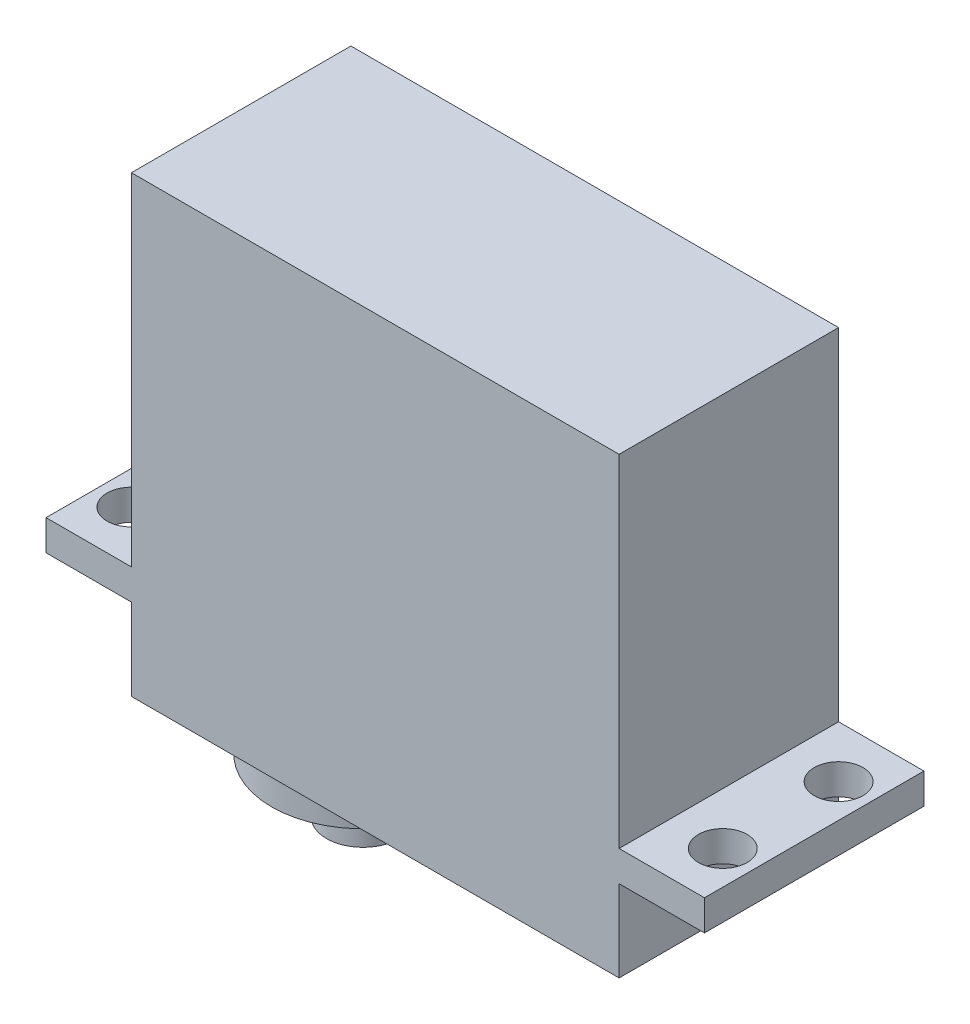
ISO-10303-21;
HEADER;
FILE_DESCRIPTION(('STEP AP214'),'2;1');
FILE_NAME('part.step','',(''),(''),'','','');
FILE_SCHEMA(('AUTOMOTIVE_DESIGN { 1 0 10303 214 1 1 1 1 }'));
ENDSEC;
DATA;
#1=APPLICATION_CONTEXT('core data for automotive mechanical design processes');
#2=APPLICATION_PROTOCOL_DEFINITION('international standard','automotive_design',2000,#1);
#3=PRODUCT_CONTEXT('',#1,'mechanical');
#4=PRODUCT('Part','Part','',(#3));
#5=PRODUCT_RELATED_PRODUCT_CATEGORY('part','',(#4));
#6=PRODUCT_DEFINITION_FORMATION('','',#4);
#7=PRODUCT_DEFINITION_CONTEXT('part definition',#1,'design');
#8=PRODUCT_DEFINITION('design','',#6,#7);
#9=PRODUCT_DEFINITION_SHAPE('','',#8);
#10=(LENGTH_UNIT() NAMED_UNIT(*) SI_UNIT(.MILLI.,.METRE.));
#11=(NAMED_UNIT(*) PLANE_ANGLE_UNIT() SI_UNIT($,.RADIAN.));
#12=(NAMED_UNIT(*) SI_UNIT($,.STERADIAN.) SOLID_ANGLE_UNIT());
#13=UNCERTAINTY_MEASURE_WITH_UNIT(LENGTH_MEASURE(1.E-05),#10,'distance_accuracy_value','');
#14=(GEOMETRIC_REPRESENTATION_CONTEXT(3) GLOBAL_UNCERTAINTY_ASSIGNED_CONTEXT((#13)) GLOBAL_UNIT_ASSIGNED_CONTEXT((#10,
#11,#12)) REPRESENTATION_CONTEXT('',''));
#15=CARTESIAN_POINT('',(0.,0.,0.));
#16=DIRECTION('',(0.,0.,1.));
#17=DIRECTION('',(1.,0.,0.));
#18=AXIS2_PLACEMENT_3D('',#15,#16,#17);
#19=CARTESIAN_POINT('',(0.,0.,0.));
#20=DIRECTION('',(0.,-1.,0.));
#21=DIRECTION('',(0.,0.,-1.));
#22=AXIS2_PLACEMENT_3D('',#19,#20,#21);
#23=PLANE('',#22);
#24=CARTESIAN_POINT('',(24.25,0.,4.75));
#25=DIRECTION('',(0.,-1.,0.));
#26=DIRECTION('',(0.,0.,-1.));
#27=AXIS2_PLACEMENT_3D('',#24,#25,#26);
#28=CIRCLE('',#27,2.);
#29=CARTESIAN_POINT('',(24.25,0.,2.75));
#30=VERTEX_POINT('',#29);
#31=EDGE_CURVE('E304',#30,#30,#28,.T.);
#32=ORIENTED_EDGE('',*,*,#31,.F.);
#33=EDGE_LOOP('',(#32));
#34=FACE_BOUND('',#33,.T.);
#35=CARTESIAN_POINT('',(24.25,0.,-4.75));
#36=DIRECTION('',(0.,-1.,0.));
#37=DIRECTION('',(0.,0.,-1.));
#38=AXIS2_PLACEMENT_3D('',#35,#36,#37);
#39=CIRCLE('',#38,2.);
#40=CARTESIAN_POINT('',(24.25,0.,-6.75));
#41=VERTEX_POINT('',#40);
#42=EDGE_CURVE('E308',#41,#41,#39,.T.);
#43=ORIENTED_EDGE('',*,*,#42,.F.);
#44=EDGE_LOOP('',(#43));
#45=FACE_BOUND('',#44,.T.);
#46=DIRECTION('',(0.,0.,1.));
#47=VECTOR('',#46,1.);
#48=CARTESIAN_POINT('',(20.,0.,-9.));
#49=LINE('',#48,#47);
#50=CARTESIAN_POINT('',(20.,0.,-9.));
#51=VERTEX_POINT('',#50);
#52=CARTESIAN_POINT('',(20.,0.,9.));
#53=VERTEX_POINT('',#52);
#54=EDGE_CURVE('E51',#51,#53,#49,.T.);
#55=ORIENTED_EDGE('',*,*,#54,.F.);
#56=DIRECTION('',(-1.,0.,0.));
#57=VECTOR('',#56,1.);
#58=CARTESIAN_POINT('',(-27.,0.,-9.));
#59=LINE('',#58,#57);
#60=CARTESIAN_POINT('',(27.,0.,-9.));
#61=VERTEX_POINT('',#60);
#62=EDGE_CURVE('E195',#61,#51,#59,.T.);
#63=ORIENTED_EDGE('',*,*,#62,.F.);
#64=DIRECTION('',(0.,0.,-1.));
#65=VECTOR('',#64,1.);
#66=CARTESIAN_POINT('',(27.,0.,9.));
#67=LINE('',#66,#65);
#68=CARTESIAN_POINT('',(27.,0.,9.));
#69=VERTEX_POINT('',#68);
#70=EDGE_CURVE('E178',#69,#61,#67,.T.);
#71=ORIENTED_EDGE('',*,*,#70,.F.);
#72=DIRECTION('',(1.,0.,0.));
#73=VECTOR('',#72,1.);
#74=CARTESIAN_POINT('',(-27.,0.,9.));
#75=LINE('',#74,#73);
#76=EDGE_CURVE('E56',#53,#69,#75,.T.);
#77=ORIENTED_EDGE('',*,*,#76,.F.);
#78=EDGE_LOOP('',(#55,#63,#71,#77));
#79=FACE_BOUND('',#78,.T.);
#80=ADVANCED_FACE('F34',(#34,#45,#79),#23,.T.);
#81=CARTESIAN_POINT('',(0.,2.5,0.));
#82=DIRECTION('',(0.,-1.,0.));
#83=DIRECTION('',(0.,0.,-1.));
#84=AXIS2_PLACEMENT_3D('',#81,#82,#83);
#85=PLANE('',#84);
#86=CARTESIAN_POINT('',(24.25,2.5,4.75));
#87=DIRECTION('',(0.,-1.,0.));
#88=DIRECTION('',(0.,0.,-1.));
#89=AXIS2_PLACEMENT_3D('',#86,#87,#88);
#90=CIRCLE('',#89,2.);
#91=CARTESIAN_POINT('',(24.25,2.5,2.75));
#92=VERTEX_POINT('',#91);
#93=EDGE_CURVE('E38',#92,#92,#90,.T.);
#94=ORIENTED_EDGE('',*,*,#93,.T.);
#95=EDGE_LOOP('',(#94));
#96=FACE_BOUND('',#95,.T.);
#97=CARTESIAN_POINT('',(24.25,2.5,-4.75));
#98=DIRECTION('',(0.,-1.,0.));
#99=DIRECTION('',(0.,0.,-1.));
#100=AXIS2_PLACEMENT_3D('',#97,#98,#99);
#101=CIRCLE('',#100,2.);
#102=CARTESIAN_POINT('',(24.25,2.5,-6.75));
#103=VERTEX_POINT('',#102);
#104=EDGE_CURVE('E212',#103,#103,#101,.T.);
#105=ORIENTED_EDGE('',*,*,#104,.T.);
#106=EDGE_LOOP('',(#105));
#107=FACE_BOUND('',#106,.T.);
#108=DIRECTION('',(0.,0.,-1.));
#109=VECTOR('',#108,1.);
#110=CARTESIAN_POINT('',(20.,2.5,-9.));
#111=LINE('',#110,#109);
#112=CARTESIAN_POINT('',(20.,2.5,9.));
#113=VERTEX_POINT('',#112);
#114=CARTESIAN_POINT('',(20.,2.5,-9.));
#115=VERTEX_POINT('',#114);
#116=EDGE_CURVE('E146',#113,#115,#111,.T.);
#117=ORIENTED_EDGE('',*,*,#116,.F.);
#118=DIRECTION('',(1.,0.,0.));
#119=VECTOR('',#118,1.);
#120=CARTESIAN_POINT('',(-27.,2.5,9.));
#121=LINE('',#120,#119);
#122=CARTESIAN_POINT('',(27.,2.5,9.));
#123=VERTEX_POINT('',#122);
#124=EDGE_CURVE('E188',#113,#123,#121,.T.);
#125=ORIENTED_EDGE('',*,*,#124,.T.);
#126=DIRECTION('',(0.,0.,-1.));
#127=VECTOR('',#126,1.);
#128=CARTESIAN_POINT('',(27.,2.5,9.));
#129=LINE('',#128,#127);
#130=CARTESIAN_POINT('',(27.,2.5,-9.));
#131=VERTEX_POINT('',#130);
#132=EDGE_CURVE('E179',#123,#131,#129,.T.);
#133=ORIENTED_EDGE('',*,*,#132,.T.);
#134=DIRECTION('',(-1.,0.,0.));
#135=VECTOR('',#134,1.);
#136=CARTESIAN_POINT('',(-27.,2.5,-9.));
#137=LINE('',#136,#135);
#138=EDGE_CURVE('E184',#131,#115,#137,.T.);
#139=ORIENTED_EDGE('',*,*,#138,.T.);
#140=EDGE_LOOP('',(#117,#125,#133,#139));
#141=FACE_BOUND('',#140,.T.);
#142=ADVANCED_FACE('F273',(#96,#107,#141),#85,.F.);
#143=CARTESIAN_POINT('',(-24.25,2.5,-4.75));
#144=DIRECTION('',(0.,-1.,0.));
#145=DIRECTION('',(0.,0.,-1.));
#146=AXIS2_PLACEMENT_3D('',#143,#144,#145);
#147=CIRCLE('',#146,2.);
#148=CARTESIAN_POINT('',(-24.25,2.5,-6.75));
#149=VERTEX_POINT('',#148);
#150=EDGE_CURVE('E214',#149,#149,#147,.T.);
#151=ORIENTED_EDGE('',*,*,#150,.T.);
#152=EDGE_LOOP('',(#151));
#153=FACE_BOUND('',#152,.T.);
#154=CARTESIAN_POINT('',(-24.25,2.5,4.75));
#155=DIRECTION('',(0.,-1.,0.));
#156=DIRECTION('',(0.,0.,-1.));
#157=AXIS2_PLACEMENT_3D('',#154,#155,#156);
#158=CIRCLE('',#157,2.);
#159=CARTESIAN_POINT('',(-24.25,2.5,2.75));
#160=VERTEX_POINT('',#159);
#161=EDGE_CURVE('E220',#160,#160,#158,.T.);
#162=ORIENTED_EDGE('',*,*,#161,.T.);
#163=EDGE_LOOP('',(#162));
#164=FACE_BOUND('',#163,.T.);
#165=DIRECTION('',(0.,0.,1.));
#166=VECTOR('',#165,1.);
#167=CARTESIAN_POINT('',(-20.,2.5,-9.));
#168=LINE('',#167,#166);
#169=CARTESIAN_POINT('',(-20.,2.5,-9.));
#170=VERTEX_POINT('',#169);
#171=CARTESIAN_POINT('',(-20.,2.5,9.));
#172=VERTEX_POINT('',#171);
#173=EDGE_CURVE('E149',#170,#172,#168,.T.);
#174=ORIENTED_EDGE('',*,*,#173,.F.);
#175=CARTESIAN_POINT('',(-27.,2.5,-9.));
#176=VERTEX_POINT('',#175);
#177=EDGE_CURVE('E182',#170,#176,#137,.T.);
#178=ORIENTED_EDGE('',*,*,#177,.T.);
#179=DIRECTION('',(0.,0.,1.));
#180=VECTOR('',#179,1.);
#181=CARTESIAN_POINT('',(-27.,2.5,9.));
#182=LINE('',#181,#180);
#183=CARTESIAN_POINT('',(-27.,2.5,9.));
#184=VERTEX_POINT('',#183);
#185=EDGE_CURVE('E186',#176,#184,#182,.T.);
#186=ORIENTED_EDGE('',*,*,#185,.T.);
#187=EDGE_CURVE('E189',#184,#172,#121,.T.);
#188=ORIENTED_EDGE('',*,*,#187,.T.);
#189=EDGE_LOOP('',(#174,#178,#186,#188));
#190=FACE_BOUND('',#189,.T.);
#191=ADVANCED_FACE('F284',(#153,#164,#190),#85,.F.);
#192=CARTESIAN_POINT('',(27.,2.5,9.));
#193=DIRECTION('',(-1.,0.,0.));
#194=DIRECTION('',(0.,0.,1.));
#195=AXIS2_PLACEMENT_3D('',#192,#193,#194);
#196=PLANE('',#195);
#197=ORIENTED_EDGE('',*,*,#70,.T.);
#198=DIRECTION('',(0.,-1.,0.));
#199=VECTOR('',#198,1.);
#200=CARTESIAN_POINT('',(27.,2.5,-9.));
#201=LINE('',#200,#199);
#202=EDGE_CURVE('E208',#131,#61,#201,.T.);
#203=ORIENTED_EDGE('',*,*,#202,.F.);
#204=ORIENTED_EDGE('',*,*,#132,.F.);
#205=DIRECTION('',(0.,-1.,0.));
#206=VECTOR('',#205,1.);
#207=CARTESIAN_POINT('',(27.,2.5,9.));
#208=LINE('',#207,#206);
#209=EDGE_CURVE('E191',#123,#69,#208,.T.);
#210=ORIENTED_EDGE('',*,*,#209,.T.);
#211=EDGE_LOOP('',(#197,#203,#204,#210));
#212=FACE_BOUND('',#211,.T.);
#213=ADVANCED_FACE('F36',(#212),#196,.F.);
#214=CARTESIAN_POINT('',(-27.,2.5,-9.));
#215=DIRECTION('',(0.,0.,1.));
#216=DIRECTION('',(1.,0.,0.));
#217=AXIS2_PLACEMENT_3D('',#214,#215,#216);
#218=PLANE('',#217);
#219=ORIENTED_EDGE('',*,*,#62,.T.);
#220=DIRECTION('',(0.,1.,0.));
#221=VECTOR('',#220,1.);
#222=CARTESIAN_POINT('',(20.,-6.7,-9.));
#223=LINE('',#222,#221);
#224=CARTESIAN_POINT('',(20.,-6.7,-9.));
#225=VERTEX_POINT('',#224);
#226=EDGE_CURVE('E236',#225,#51,#223,.T.);
#227=ORIENTED_EDGE('',*,*,#226,.F.);
#228=DIRECTION('',(1.,0.,0.));
#229=VECTOR('',#228,1.);
#230=CARTESIAN_POINT('',(-20.,-6.7,-9.));
#231=LINE('',#230,#229);
#232=CARTESIAN_POINT('',(-20.,-6.7,-9.));
#233=VERTEX_POINT('',#232);
#234=EDGE_CURVE('E139',#233,#225,#231,.T.);
#235=ORIENTED_EDGE('',*,*,#234,.F.);
#236=DIRECTION('',(0.,1.,0.));
#237=VECTOR('',#236,1.);
#238=CARTESIAN_POINT('',(-20.,-6.7,-9.));
#239=LINE('',#238,#237);
#240=CARTESIAN_POINT('',(-20.,0.,-9.));
#241=VERTEX_POINT('',#240);
#242=EDGE_CURVE('E151',#233,#241,#239,.T.);
#243=ORIENTED_EDGE('',*,*,#242,.T.);
#244=CARTESIAN_POINT('',(-27.,0.,-9.));
#245=VERTEX_POINT('',#244);
#246=EDGE_CURVE('E194',#241,#245,#59,.T.);
#247=ORIENTED_EDGE('',*,*,#246,.T.);
#248=DIRECTION('',(0.,-1.,0.));
#249=VECTOR('',#248,1.);
#250=CARTESIAN_POINT('',(-27.,2.5,-9.));
#251=LINE('',#250,#249);
#252=EDGE_CURVE('E205',#176,#245,#251,.T.);
#253=ORIENTED_EDGE('',*,*,#252,.F.);
#254=ORIENTED_EDGE('',*,*,#177,.F.);
#255=DIRECTION('',(0.,-1.,0.));
#256=VECTOR('',#255,1.);
#257=CARTESIAN_POINT('',(-20.,30.5,-9.));
#258=LINE('',#257,#256);
#259=CARTESIAN_POINT('',(-20.,30.5,-9.));
#260=VERTEX_POINT('',#259);
#261=EDGE_CURVE('E172',#260,#170,#258,.T.);
#262=ORIENTED_EDGE('',*,*,#261,.F.);
#263=DIRECTION('',(-1.,0.,0.));
#264=VECTOR('',#263,1.);
#265=CARTESIAN_POINT('',(-20.,30.5,-9.));
#266=LINE('',#265,#264);
#267=CARTESIAN_POINT('',(20.,30.5,-9.));
#268=VERTEX_POINT('',#267);
#269=EDGE_CURVE('E158',#268,#260,#266,.T.);
#270=ORIENTED_EDGE('',*,*,#269,.F.);
#271=DIRECTION('',(0.,-1.,0.));
#272=VECTOR('',#271,1.);
#273=CARTESIAN_POINT('',(20.,30.5,-9.));
#274=LINE('',#273,#272);
#275=EDGE_CURVE('E175',#268,#115,#274,.T.);
#276=ORIENTED_EDGE('',*,*,#275,.T.);
#277=ORIENTED_EDGE('',*,*,#138,.F.);
#278=ORIENTED_EDGE('',*,*,#202,.T.);
#279=EDGE_LOOP('',(#219,#227,#235,#243,#247,#253,#254,#262,#270,#276,#277,#278));
#280=FACE_BOUND('',#279,.T.);
#281=ADVANCED_FACE('F243',(#280),#218,.F.);
#282=CARTESIAN_POINT('',(-27.,2.5,9.));
#283=DIRECTION('',(1.,0.,0.));
#284=DIRECTION('',(0.,0.,-1.));
#285=AXIS2_PLACEMENT_3D('',#282,#283,#284);
#286=PLANE('',#285);
#287=DIRECTION('',(0.,0.,1.));
#288=VECTOR('',#287,1.);
#289=CARTESIAN_POINT('',(-27.,0.,9.));
#290=LINE('',#289,#288);
#291=CARTESIAN_POINT('',(-27.,0.,9.));
#292=VERTEX_POINT('',#291);
#293=EDGE_CURVE('E197',#245,#292,#290,.T.);
#294=ORIENTED_EDGE('',*,*,#293,.T.);
#295=DIRECTION('',(0.,-1.,0.));
#296=VECTOR('',#295,1.);
#297=CARTESIAN_POINT('',(-27.,2.5,9.));
#298=LINE('',#297,#296);
#299=EDGE_CURVE('E202',#184,#292,#298,.T.);
#300=ORIENTED_EDGE('',*,*,#299,.F.);
#301=ORIENTED_EDGE('',*,*,#185,.F.);
#302=ORIENTED_EDGE('',*,*,#252,.T.);
#303=EDGE_LOOP('',(#294,#300,#301,#302));
#304=FACE_BOUND('',#303,.T.);
#305=ADVANCED_FACE('F255',(#304),#286,.F.);
#306=CARTESIAN_POINT('',(-27.,2.5,9.));
#307=DIRECTION('',(0.,0.,-1.));
#308=DIRECTION('',(-1.,0.,0.));
#309=AXIS2_PLACEMENT_3D('',#306,#307,#308);
#310=PLANE('',#309);
#311=CARTESIAN_POINT('',(-20.,0.,9.));
#312=VERTEX_POINT('',#311);
#313=EDGE_CURVE('E183',#292,#312,#75,.T.);
#314=ORIENTED_EDGE('',*,*,#313,.T.);
#315=DIRECTION('',(0.,1.,0.));
#316=VECTOR('',#315,1.);
#317=CARTESIAN_POINT('',(-20.,-6.7,9.));
#318=LINE('',#317,#316);
#319=CARTESIAN_POINT('',(-20.,-6.7,9.));
#320=VERTEX_POINT('',#319);
#321=EDGE_CURVE('E130',#320,#312,#318,.T.);
#322=ORIENTED_EDGE('',*,*,#321,.F.);
#323=DIRECTION('',(-1.,0.,0.));
#324=VECTOR('',#323,1.);
#325=CARTESIAN_POINT('',(-20.,-6.7,9.));
#326=LINE('',#325,#324);
#327=CARTESIAN_POINT('',(20.,-6.7,9.));
#328=VERTEX_POINT('',#327);
#329=EDGE_CURVE('E123',#328,#320,#326,.T.);
#330=ORIENTED_EDGE('',*,*,#329,.F.);
#331=DIRECTION('',(0.,1.,0.));
#332=VECTOR('',#331,1.);
#333=CARTESIAN_POINT('',(20.,-6.7,9.));
#334=LINE('',#333,#332);
#335=EDGE_CURVE('E128',#328,#53,#334,.T.);
#336=ORIENTED_EDGE('',*,*,#335,.T.);
#337=ORIENTED_EDGE('',*,*,#76,.T.);
#338=ORIENTED_EDGE('',*,*,#209,.F.);
#339=ORIENTED_EDGE('',*,*,#124,.F.);
#340=DIRECTION('',(0.,-1.,0.));
#341=VECTOR('',#340,1.);
#342=CARTESIAN_POINT('',(20.,30.5,9.));
#343=LINE('',#342,#341);
#344=CARTESIAN_POINT('',(20.,30.5,9.));
#345=VERTEX_POINT('',#344);
#346=EDGE_CURVE('E163',#345,#113,#343,.T.);
#347=ORIENTED_EDGE('',*,*,#346,.F.);
#348=DIRECTION('',(1.,0.,0.));
#349=VECTOR('',#348,1.);
#350=CARTESIAN_POINT('',(-20.,30.5,9.));
#351=LINE('',#350,#349);
#352=CARTESIAN_POINT('',(-20.,30.5,9.));
#353=VERTEX_POINT('',#352);
#354=EDGE_CURVE('E162',#353,#345,#351,.T.);
#355=ORIENTED_EDGE('',*,*,#354,.F.);
#356=DIRECTION('',(0.,-1.,0.));
#357=VECTOR('',#356,1.);
#358=CARTESIAN_POINT('',(-20.,30.5,9.));
#359=LINE('',#358,#357);
#360=EDGE_CURVE('E169',#353,#172,#359,.T.);
#361=ORIENTED_EDGE('',*,*,#360,.T.);
#362=ORIENTED_EDGE('',*,*,#187,.F.);
#363=ORIENTED_EDGE('',*,*,#299,.T.);
#364=EDGE_LOOP('',(#314,#322,#330,#336,#337,#338,#339,#347,#355,#361,#362,#363));
#365=FACE_BOUND('',#364,.T.);
#366=ADVANCED_FACE('F126',(#365),#310,.F.);
#367=CARTESIAN_POINT('',(-24.25,0.,-4.75));
#368=DIRECTION('',(0.,-1.,0.));
#369=DIRECTION('',(0.,0.,-1.));
#370=AXIS2_PLACEMENT_3D('',#367,#368,#369);
#371=CIRCLE('',#370,2.);
#372=CARTESIAN_POINT('',(-24.25,0.,-6.75));
#373=VERTEX_POINT('',#372);
#374=EDGE_CURVE('E300',#373,#373,#371,.T.);
#375=ORIENTED_EDGE('',*,*,#374,.F.);
#376=EDGE_LOOP('',(#375));
#377=FACE_BOUND('',#376,.T.);
#378=CARTESIAN_POINT('',(-24.25,0.,4.75));
#379=DIRECTION('',(0.,-1.,0.));
#380=DIRECTION('',(0.,0.,-1.));
#381=AXIS2_PLACEMENT_3D('',#378,#379,#380);
#382=CIRCLE('',#381,2.);
#383=CARTESIAN_POINT('',(-24.25,0.,2.75));
#384=VERTEX_POINT('',#383);
#385=EDGE_CURVE('E225',#384,#384,#382,.T.);
#386=ORIENTED_EDGE('',*,*,#385,.F.);
#387=EDGE_LOOP('',(#386));
#388=FACE_BOUND('',#387,.T.);
#389=DIRECTION('',(0.,0.,-1.));
#390=VECTOR('',#389,1.);
#391=CARTESIAN_POINT('',(-20.,0.,-9.));
#392=LINE('',#391,#390);
#393=EDGE_CURVE('E143',#312,#241,#392,.T.);
#394=ORIENTED_EDGE('',*,*,#393,.F.);
#395=ORIENTED_EDGE('',*,*,#313,.F.);
#396=ORIENTED_EDGE('',*,*,#293,.F.);
#397=ORIENTED_EDGE('',*,*,#246,.F.);
#398=EDGE_LOOP('',(#394,#395,#396,#397));
#399=FACE_BOUND('',#398,.T.);
#400=ADVANCED_FACE('F249',(#377,#388,#399),#23,.T.);
#401=CARTESIAN_POINT('',(20.,30.5,-9.));
#402=DIRECTION('',(-1.,0.,0.));
#403=DIRECTION('',(0.,0.,1.));
#404=AXIS2_PLACEMENT_3D('',#401,#402,#403);
#405=PLANE('',#404);
#406=ORIENTED_EDGE('',*,*,#116,.T.);
#407=ORIENTED_EDGE('',*,*,#275,.F.);
#408=DIRECTION('',(0.,0.,-1.));
#409=VECTOR('',#408,1.);
#410=CARTESIAN_POINT('',(20.,30.5,-9.));
#411=LINE('',#410,#409);
#412=EDGE_CURVE('E155',#345,#268,#411,.T.);
#413=ORIENTED_EDGE('',*,*,#412,.F.);
#414=ORIENTED_EDGE('',*,*,#346,.T.);
#415=EDGE_LOOP('',(#406,#407,#413,#414));
#416=FACE_BOUND('',#415,.T.);
#417=ADVANCED_FACE('F270',(#416),#405,.F.);
#418=CARTESIAN_POINT('',(-20.,30.5,-9.));
#419=DIRECTION('',(1.,0.,0.));
#420=DIRECTION('',(0.,0.,-1.));
#421=AXIS2_PLACEMENT_3D('',#418,#419,#420);
#422=PLANE('',#421);
#423=ORIENTED_EDGE('',*,*,#173,.T.);
#424=ORIENTED_EDGE('',*,*,#360,.F.);
#425=DIRECTION('',(0.,0.,1.));
#426=VECTOR('',#425,1.);
#427=CARTESIAN_POINT('',(-20.,30.5,-9.));
#428=LINE('',#427,#426);
#429=EDGE_CURVE('E160',#260,#353,#428,.T.);
#430=ORIENTED_EDGE('',*,*,#429,.F.);
#431=ORIENTED_EDGE('',*,*,#261,.T.);
#432=EDGE_LOOP('',(#423,#424,#430,#431));
#433=FACE_BOUND('',#432,.T.);
#434=ADVANCED_FACE('F261',(#433),#422,.F.);
#435=CARTESIAN_POINT('',(0.,30.5,0.));
#436=DIRECTION('',(0.,1.,0.));
#437=DIRECTION('',(0.,0.,1.));
#438=AXIS2_PLACEMENT_3D('',#435,#436,#437);
#439=PLANE('',#438);
#440=ORIENTED_EDGE('',*,*,#412,.T.);
#441=ORIENTED_EDGE('',*,*,#269,.T.);
#442=ORIENTED_EDGE('',*,*,#429,.T.);
#443=ORIENTED_EDGE('',*,*,#354,.T.);
#444=EDGE_LOOP('',(#440,#441,#442,#443));
#445=FACE_BOUND('',#444,.T.);
#446=ADVANCED_FACE('F265',(#445),#439,.T.);
#447=CARTESIAN_POINT('',(20.,-6.7,-9.));
#448=DIRECTION('',(-1.,0.,0.));
#449=DIRECTION('',(0.,0.,1.));
#450=AXIS2_PLACEMENT_3D('',#447,#448,#449);
#451=PLANE('',#450);
#452=ORIENTED_EDGE('',*,*,#54,.T.);
#453=ORIENTED_EDGE('',*,*,#335,.F.);
#454=DIRECTION('',(0.,0.,1.));
#455=VECTOR('',#454,1.);
#456=CARTESIAN_POINT('',(20.,-6.7,-9.));
#457=LINE('',#456,#455);
#458=EDGE_CURVE('E134',#225,#328,#457,.T.);
#459=ORIENTED_EDGE('',*,*,#458,.F.);
#460=ORIENTED_EDGE('',*,*,#226,.T.);
#461=EDGE_LOOP('',(#452,#453,#459,#460));
#462=FACE_BOUND('',#461,.T.);
#463=ADVANCED_FACE('F145',(#462),#451,.F.);
#464=CARTESIAN_POINT('',(-20.,-6.7,-9.));
#465=DIRECTION('',(1.,0.,0.));
#466=DIRECTION('',(0.,0.,-1.));
#467=AXIS2_PLACEMENT_3D('',#464,#465,#466);
#468=PLANE('',#467);
#469=ORIENTED_EDGE('',*,*,#393,.T.);
#470=ORIENTED_EDGE('',*,*,#242,.F.);
#471=DIRECTION('',(0.,0.,-1.));
#472=VECTOR('',#471,1.);
#473=CARTESIAN_POINT('',(-20.,-6.7,-9.));
#474=LINE('',#473,#472);
#475=EDGE_CURVE('E133',#320,#233,#474,.T.);
#476=ORIENTED_EDGE('',*,*,#475,.F.);
#477=ORIENTED_EDGE('',*,*,#321,.T.);
#478=EDGE_LOOP('',(#469,#470,#476,#477));
#479=FACE_BOUND('',#478,.T.);
#480=ADVANCED_FACE('F246',(#479),#468,.F.);
#481=CARTESIAN_POINT('',(0.,-6.7,0.));
#482=DIRECTION('',(0.,1.,0.));
#483=DIRECTION('',(0.,0.,1.));
#484=AXIS2_PLACEMENT_3D('',#481,#482,#483);
#485=PLANE('',#484);
#486=CARTESIAN_POINT('',(-10.,-6.7,0.));
#487=DIRECTION('',(0.,1.,0.));
#488=DIRECTION('',(0.,0.,1.));
#489=AXIS2_PLACEMENT_3D('',#486,#487,#488);
#490=CIRCLE('',#489,7.5);
#491=CARTESIAN_POINT('',(-10.,-6.7,7.5));
#492=VERTEX_POINT('',#491);
#493=EDGE_CURVE('E43',#492,#492,#490,.F.);
#494=ORIENTED_EDGE('',*,*,#493,.F.);
#495=EDGE_LOOP('',(#494));
#496=FACE_BOUND('',#495,.T.);
#497=ORIENTED_EDGE('',*,*,#458,.T.);
#498=ORIENTED_EDGE('',*,*,#329,.T.);
#499=ORIENTED_EDGE('',*,*,#475,.T.);
#500=ORIENTED_EDGE('',*,*,#234,.T.);
#501=EDGE_LOOP('',(#497,#498,#499,#500));
#502=FACE_BOUND('',#501,.T.);
#503=ADVANCED_FACE('F137',(#496,#502),#485,.F.);
#504=CARTESIAN_POINT('',(-10.,-10.3,0.));
#505=DIRECTION('',(0.,1.,0.));
#506=DIRECTION('',(0.,0.,1.));
#507=AXIS2_PLACEMENT_3D('',#504,#505,#506);
#508=CYLINDRICAL_SURFACE('',#507,7.5);
#509=CARTESIAN_POINT('',(-10.,-10.3,0.));
#510=DIRECTION('',(0.,-1.,0.));
#511=DIRECTION('',(0.,0.,-1.));
#512=AXIS2_PLACEMENT_3D('',#509,#510,#511);
#513=CIRCLE('',#512,7.5);
#514=CARTESIAN_POINT('',(-10.,-10.3,-7.5));
#515=VERTEX_POINT('',#514);
#516=EDGE_CURVE('E230',#515,#515,#513,.T.);
#517=ORIENTED_EDGE('',*,*,#516,.F.);
#518=EDGE_LOOP('',(#517));
#519=FACE_BOUND('',#518,.T.);
#520=ORIENTED_EDGE('',*,*,#493,.T.);
#521=EDGE_LOOP('',(#520));
#522=FACE_BOUND('',#521,.T.);
#523=ADVANCED_FACE('F342',(#519,#522),#508,.T.);
#524=CARTESIAN_POINT('',(-10.,-10.3,0.));
#525=DIRECTION('',(0.,-1.,0.));
#526=DIRECTION('',(0.,0.,-1.));
#527=AXIS2_PLACEMENT_3D('',#524,#525,#526);
#528=PLANE('',#527);
#529=CARTESIAN_POINT('',(-10.,-10.3,0.));
#530=DIRECTION('',(0.,-1.,0.));
#531=DIRECTION('',(0.,0.,-1.));
#532=AXIS2_PLACEMENT_3D('',#529,#530,#531);
#533=CIRCLE('',#532,3.);
#534=CARTESIAN_POINT('',(-10.,-10.3,-3.));
#535=VERTEX_POINT('',#534);
#536=EDGE_CURVE('E11',#535,#535,#533,.T.);
#537=ORIENTED_EDGE('',*,*,#536,.F.);
#538=EDGE_LOOP('',(#537));
#539=FACE_BOUND('',#538,.T.);
#540=ORIENTED_EDGE('',*,*,#516,.T.);
#541=EDGE_LOOP('',(#540));
#542=FACE_BOUND('',#541,.T.);
#543=ADVANCED_FACE('F338',(#539,#542),#528,.T.);
#544=CARTESIAN_POINT('',(-10.,-14.8,0.));
#545=DIRECTION('',(0.,1.,0.));
#546=DIRECTION('',(0.,0.,1.));
#547=AXIS2_PLACEMENT_3D('',#544,#545,#546);
#548=CYLINDRICAL_SURFACE('',#547,3.);
#549=CARTESIAN_POINT('',(-10.,-14.8,0.));
#550=DIRECTION('',(0.,-1.,0.));
#551=DIRECTION('',(0.,0.,-1.));
#552=AXIS2_PLACEMENT_3D('',#549,#550,#551);
#553=CIRCLE('',#552,3.);
#554=CARTESIAN_POINT('',(-10.,-14.8,-3.));
#555=VERTEX_POINT('',#554);
#556=EDGE_CURVE('E218',#555,#555,#553,.T.);
#557=ORIENTED_EDGE('',*,*,#556,.F.);
#558=EDGE_LOOP('',(#557));
#559=FACE_BOUND('',#558,.T.);
#560=ORIENTED_EDGE('',*,*,#536,.T.);
#561=EDGE_LOOP('',(#560));
#562=FACE_BOUND('',#561,.T.);
#563=ADVANCED_FACE('F334',(#559,#562),#548,.T.);
#564=CARTESIAN_POINT('',(-10.,-14.8,0.));
#565=DIRECTION('',(0.,-1.,0.));
#566=DIRECTION('',(0.,0.,-1.));
#567=AXIS2_PLACEMENT_3D('',#564,#565,#566);
#568=PLANE('',#567);
#569=ORIENTED_EDGE('',*,*,#556,.T.);
#570=EDGE_LOOP('',(#569));
#571=FACE_BOUND('',#570,.T.);
#572=ADVANCED_FACE('F331',(#571),#568,.T.);
#573=CARTESIAN_POINT('',(-24.25,4.5,4.75));
#574=DIRECTION('',(0.,-1.,0.));
#575=DIRECTION('',(0.,0.,-1.));
#576=AXIS2_PLACEMENT_3D('',#573,#574,#575);
#577=CYLINDRICAL_SURFACE('',#576,2.);
#578=ORIENTED_EDGE('',*,*,#385,.T.);
#579=EDGE_LOOP('',(#578));
#580=FACE_BOUND('',#579,.T.);
#581=ORIENTED_EDGE('',*,*,#161,.F.);
#582=EDGE_LOOP('',(#581));
#583=FACE_BOUND('',#582,.T.);
#584=ADVANCED_FACE('F325',(#580,#583),#577,.F.);
#585=CARTESIAN_POINT('',(-24.25,4.5,-4.75));
#586=DIRECTION('',(0.,-1.,0.));
#587=DIRECTION('',(0.,0.,-1.));
#588=AXIS2_PLACEMENT_3D('',#585,#586,#587);
#589=CYLINDRICAL_SURFACE('',#588,2.);
#590=ORIENTED_EDGE('',*,*,#374,.T.);
#591=EDGE_LOOP('',(#590));
#592=FACE_BOUND('',#591,.T.);
#593=ORIENTED_EDGE('',*,*,#150,.F.);
#594=EDGE_LOOP('',(#593));
#595=FACE_BOUND('',#594,.T.);
#596=ADVANCED_FACE('F317',(#592,#595),#589,.F.);
#597=CARTESIAN_POINT('',(24.25,4.5,-4.75));
#598=DIRECTION('',(0.,-1.,0.));
#599=DIRECTION('',(0.,0.,-1.));
#600=AXIS2_PLACEMENT_3D('',#597,#598,#599);
#601=CYLINDRICAL_SURFACE('',#600,2.);
#602=ORIENTED_EDGE('',*,*,#42,.T.);
#603=EDGE_LOOP('',(#602));
#604=FACE_BOUND('',#603,.T.);
#605=ORIENTED_EDGE('',*,*,#104,.F.);
#606=EDGE_LOOP('',(#605));
#607=FACE_BOUND('',#606,.T.);
#608=ADVANCED_FACE('F313',(#604,#607),#601,.F.);
#609=CARTESIAN_POINT('',(24.25,4.5,4.75));
#610=DIRECTION('',(0.,-1.,0.));
#611=DIRECTION('',(0.,0.,-1.));
#612=AXIS2_PLACEMENT_3D('',#609,#610,#611);
#613=CYLINDRICAL_SURFACE('',#612,2.);
#614=ORIENTED_EDGE('',*,*,#31,.T.);
#615=EDGE_LOOP('',(#614));
#616=FACE_BOUND('',#615,.T.);
#617=ORIENTED_EDGE('',*,*,#93,.F.);
#618=EDGE_LOOP('',(#617));
#619=FACE_BOUND('',#618,.T.);
#620=ADVANCED_FACE('F316',(#616,#619),#613,.F.);
#621=CLOSED_SHELL('',(#80,#142,#191,#213,#281,#305,#366,#400,#417,#434,#446,#463,#480,#503,#523,
#543,#563,#572,#584,#596,#608,#620));
#622=MANIFOLD_SOLID_BREP('B2',#621);
#623=ADVANCED_BREP_SHAPE_REPRESENTATION('',(#18,#622),#14);
#624=SHAPE_DEFINITION_REPRESENTATION(#9,#623);
ENDSEC;
END-ISO-10303-21;
